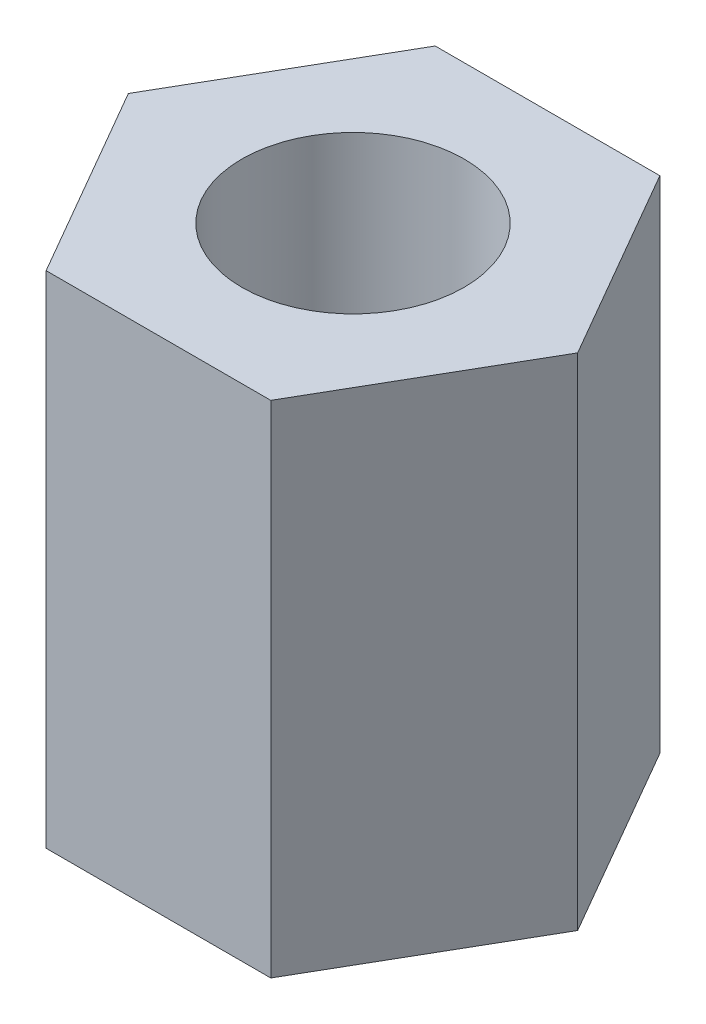
ISO-10303-21;
HEADER;
FILE_DESCRIPTION(('STEP AP214'),'2;1');
FILE_NAME('part.step','',(''),(''),'','','');
FILE_SCHEMA(('AUTOMOTIVE_DESIGN { 1 0 10303 214 1 1 1 1 }'));
ENDSEC;
DATA;
#1=APPLICATION_CONTEXT('core data for automotive mechanical design processes');
#2=APPLICATION_PROTOCOL_DEFINITION('international standard','automotive_design',2000,#1);
#3=PRODUCT_CONTEXT('',#1,'mechanical');
#4=PRODUCT('Part','Part','',(#3));
#5=PRODUCT_RELATED_PRODUCT_CATEGORY('part','',(#4));
#6=PRODUCT_DEFINITION_FORMATION('','',#4);
#7=PRODUCT_DEFINITION_CONTEXT('part definition',#1,'design');
#8=PRODUCT_DEFINITION('design','',#6,#7);
#9=PRODUCT_DEFINITION_SHAPE('','',#8);
#10=(LENGTH_UNIT() NAMED_UNIT(*) SI_UNIT(.MILLI.,.METRE.));
#11=(NAMED_UNIT(*) PLANE_ANGLE_UNIT() SI_UNIT($,.RADIAN.));
#12=(NAMED_UNIT(*) SI_UNIT($,.STERADIAN.) SOLID_ANGLE_UNIT());
#13=UNCERTAINTY_MEASURE_WITH_UNIT(LENGTH_MEASURE(1.E-05),#10,'distance_accuracy_value','');
#14=(GEOMETRIC_REPRESENTATION_CONTEXT(3) GLOBAL_UNCERTAINTY_ASSIGNED_CONTEXT((#13)) GLOBAL_UNIT_ASSIGNED_CONTEXT((#10,
#11,#12)) REPRESENTATION_CONTEXT('',''));
#15=CARTESIAN_POINT('',(0.,0.,0.));
#16=DIRECTION('',(0.,0.,1.));
#17=DIRECTION('',(1.,0.,0.));
#18=AXIS2_PLACEMENT_3D('',#15,#16,#17);
#19=CARTESIAN_POINT('',(0.,9.,0.));
#20=DIRECTION('',(0.,1.,0.));
#21=DIRECTION('',(0.,0.,1.));
#22=AXIS2_PLACEMENT_3D('',#19,#20,#21);
#23=PLANE('',#22);
#24=DIRECTION('',(0.499999999999995,0.,-0.866025403784442));
#25=VECTOR('',#24,1.);
#26=CARTESIAN_POINT('',(2.02072594216372,9.,3.49999999999996));
#27=LINE('',#26,#25);
#28=CARTESIAN_POINT('',(2.02072594216372,9.,3.49999999999996));
#29=VERTEX_POINT('',#28);
#30=CARTESIAN_POINT('',(4.04145188432737,9.,0.));
#31=VERTEX_POINT('',#30);
#32=EDGE_CURVE('E146',#29,#31,#27,.T.);
#33=ORIENTED_EDGE('',*,*,#32,.T.);
#34=DIRECTION('',(-0.500000000000001,0.,-0.866025403784438));
#35=VECTOR('',#34,1.);
#36=CARTESIAN_POINT('',(4.04145188432737,9.,0.));
#37=LINE('',#36,#35);
#38=CARTESIAN_POINT('',(2.02072594216367,9.,-3.49999999999999));
#39=VERTEX_POINT('',#38);
#40=EDGE_CURVE('E94',#31,#39,#37,.T.);
#41=ORIENTED_EDGE('',*,*,#40,.T.);
#42=DIRECTION('',(-1.,0.,0.));
#43=VECTOR('',#42,1.);
#44=CARTESIAN_POINT('',(2.02072594216367,9.,-3.49999999999999));
#45=LINE('',#44,#43);
#46=CARTESIAN_POINT('',(-2.0207259421637,9.,-3.49999999999998));
#47=VERTEX_POINT('',#46);
#48=EDGE_CURVE('E107',#39,#47,#45,.T.);
#49=ORIENTED_EDGE('',*,*,#48,.T.);
#50=DIRECTION('',(-0.499999999999995,0.,0.866025403784442));
#51=VECTOR('',#50,1.);
#52=CARTESIAN_POINT('',(-2.0207259421637,9.,-3.49999999999998));
#53=LINE('',#52,#51);
#54=CARTESIAN_POINT('',(-4.04145188432737,9.,0.));
#55=VERTEX_POINT('',#54);
#56=EDGE_CURVE('E101',#47,#55,#53,.T.);
#57=ORIENTED_EDGE('',*,*,#56,.T.);
#58=DIRECTION('',(0.500000000000007,0.,0.866025403784435));
#59=VECTOR('',#58,1.);
#60=CARTESIAN_POINT('',(-4.04145188432737,9.,0.));
#61=LINE('',#60,#59);
#62=CARTESIAN_POINT('',(-2.02072594216365,9.,3.50000000000001));
#63=VERTEX_POINT('',#62);
#64=EDGE_CURVE('E105',#55,#63,#61,.T.);
#65=ORIENTED_EDGE('',*,*,#64,.T.);
#66=DIRECTION('',(1.,0.,0.));
#67=VECTOR('',#66,1.);
#68=CARTESIAN_POINT('',(-2.02072594216365,9.,3.50000000000001));
#69=LINE('',#68,#67);
#70=EDGE_CURVE('E57',#63,#29,#69,.T.);
#71=ORIENTED_EDGE('',*,*,#70,.T.);
#72=EDGE_LOOP('',(#33,#41,#49,#57,#65,#71));
#73=FACE_BOUND('',#72,.T.);
#74=CARTESIAN_POINT('',(0.,9.,0.));
#75=DIRECTION('',(0.,1.,0.));
#76=DIRECTION('',(0.,0.,1.));
#77=AXIS2_PLACEMENT_3D('',#74,#75,#76);
#78=CIRCLE('',#77,2.);
#79=CARTESIAN_POINT('',(0.,9.,2.));
#80=VERTEX_POINT('',#79);
#81=EDGE_CURVE('E134',#80,#80,#78,.T.);
#82=ORIENTED_EDGE('',*,*,#81,.F.);
#83=EDGE_LOOP('',(#82));
#84=FACE_BOUND('',#83,.T.);
#85=ADVANCED_FACE('F39',(#73,#84),#23,.T.);
#86=CARTESIAN_POINT('',(0.,0.,0.));
#87=DIRECTION('',(0.,1.,0.));
#88=DIRECTION('',(0.,0.,1.));
#89=AXIS2_PLACEMENT_3D('',#86,#87,#88);
#90=PLANE('',#89);
#91=DIRECTION('',(0.499999999999995,0.,-0.866025403784442));
#92=VECTOR('',#91,1.);
#93=CARTESIAN_POINT('',(2.02072594216372,0.,3.49999999999996));
#94=LINE('',#93,#92);
#95=CARTESIAN_POINT('',(2.02072594216372,0.,3.49999999999996));
#96=VERTEX_POINT('',#95);
#97=CARTESIAN_POINT('',(4.04145188432737,0.,0.));
#98=VERTEX_POINT('',#97);
#99=EDGE_CURVE('E129',#96,#98,#94,.T.);
#100=ORIENTED_EDGE('',*,*,#99,.F.);
#101=DIRECTION('',(1.,0.,0.));
#102=VECTOR('',#101,1.);
#103=CARTESIAN_POINT('',(-2.02072594216365,0.,3.50000000000001));
#104=LINE('',#103,#102);
#105=CARTESIAN_POINT('',(-2.02072594216365,0.,3.50000000000001));
#106=VERTEX_POINT('',#105);
#107=EDGE_CURVE('E86',#106,#96,#104,.T.);
#108=ORIENTED_EDGE('',*,*,#107,.F.);
#109=DIRECTION('',(0.500000000000007,0.,0.866025403784435));
#110=VECTOR('',#109,1.);
#111=CARTESIAN_POINT('',(-4.04145188432737,0.,0.));
#112=LINE('',#111,#110);
#113=CARTESIAN_POINT('',(-4.04145188432737,0.,0.));
#114=VERTEX_POINT('',#113);
#115=EDGE_CURVE('E80',#114,#106,#112,.T.);
#116=ORIENTED_EDGE('',*,*,#115,.F.);
#117=DIRECTION('',(-0.499999999999995,0.,0.866025403784442));
#118=VECTOR('',#117,1.);
#119=CARTESIAN_POINT('',(-2.0207259421637,0.,-3.49999999999998));
#120=LINE('',#119,#118);
#121=CARTESIAN_POINT('',(-2.0207259421637,0.,-3.49999999999998));
#122=VERTEX_POINT('',#121);
#123=EDGE_CURVE('E116',#122,#114,#120,.T.);
#124=ORIENTED_EDGE('',*,*,#123,.F.);
#125=DIRECTION('',(-1.,0.,0.));
#126=VECTOR('',#125,1.);
#127=CARTESIAN_POINT('',(2.02072594216367,0.,-3.49999999999999));
#128=LINE('',#127,#126);
#129=CARTESIAN_POINT('',(2.02072594216367,0.,-3.49999999999999));
#130=VERTEX_POINT('',#129);
#131=EDGE_CURVE('E137',#130,#122,#128,.T.);
#132=ORIENTED_EDGE('',*,*,#131,.F.);
#133=DIRECTION('',(-0.500000000000001,0.,-0.866025403784438));
#134=VECTOR('',#133,1.);
#135=CARTESIAN_POINT('',(4.04145188432737,0.,0.));
#136=LINE('',#135,#134);
#137=EDGE_CURVE('E133',#98,#130,#136,.T.);
#138=ORIENTED_EDGE('',*,*,#137,.F.);
#139=EDGE_LOOP('',(#100,#108,#116,#124,#132,#138));
#140=FACE_BOUND('',#139,.T.);
#141=CARTESIAN_POINT('',(0.,0.,0.));
#142=DIRECTION('',(0.,1.,0.));
#143=DIRECTION('',(0.,0.,1.));
#144=AXIS2_PLACEMENT_3D('',#141,#142,#143);
#145=CIRCLE('',#144,2.);
#146=CARTESIAN_POINT('',(0.,0.,2.));
#147=VERTEX_POINT('',#146);
#148=EDGE_CURVE('E243',#147,#147,#145,.T.);
#149=ORIENTED_EDGE('',*,*,#148,.T.);
#150=EDGE_LOOP('',(#149));
#151=FACE_BOUND('',#150,.T.);
#152=ADVANCED_FACE('F159',(#140,#151),#90,.F.);
#153=CARTESIAN_POINT('',(2.02072594216372,9.,3.49999999999996));
#154=DIRECTION('',(-0.866025403784442,0.,-0.499999999999995));
#155=DIRECTION('',(-0.499999999999995,0.,0.866025403784442));
#156=AXIS2_PLACEMENT_3D('',#153,#154,#155);
#157=PLANE('',#156);
#158=ORIENTED_EDGE('',*,*,#99,.T.);
#159=DIRECTION('',(0.,-1.,0.));
#160=VECTOR('',#159,1.);
#161=CARTESIAN_POINT('',(4.04145188432737,9.,0.));
#162=LINE('',#161,#160);
#163=EDGE_CURVE('E11',#31,#98,#162,.T.);
#164=ORIENTED_EDGE('',*,*,#163,.F.);
#165=ORIENTED_EDGE('',*,*,#32,.F.);
#166=DIRECTION('',(0.,-1.,0.));
#167=VECTOR('',#166,1.);
#168=CARTESIAN_POINT('',(2.02072594216372,9.,3.49999999999996));
#169=LINE('',#168,#167);
#170=EDGE_CURVE('E125',#29,#96,#169,.T.);
#171=ORIENTED_EDGE('',*,*,#170,.T.);
#172=EDGE_LOOP('',(#158,#164,#165,#171));
#173=FACE_BOUND('',#172,.T.);
#174=ADVANCED_FACE('F41',(#173),#157,.F.);
#175=CARTESIAN_POINT('',(4.04145188432737,9.,0.));
#176=DIRECTION('',(-0.866025403784438,0.,0.500000000000001));
#177=DIRECTION('',(0.500000000000001,0.,0.866025403784438));
#178=AXIS2_PLACEMENT_3D('',#175,#176,#177);
#179=PLANE('',#178);
#180=ORIENTED_EDGE('',*,*,#137,.T.);
#181=DIRECTION('',(0.,-1.,0.));
#182=VECTOR('',#181,1.);
#183=CARTESIAN_POINT('',(2.02072594216367,9.,-3.49999999999999));
#184=LINE('',#183,#182);
#185=EDGE_CURVE('E49',#39,#130,#184,.T.);
#186=ORIENTED_EDGE('',*,*,#185,.F.);
#187=ORIENTED_EDGE('',*,*,#40,.F.);
#188=ORIENTED_EDGE('',*,*,#163,.T.);
#189=EDGE_LOOP('',(#180,#186,#187,#188));
#190=FACE_BOUND('',#189,.T.);
#191=ADVANCED_FACE('F184',(#190),#179,.F.);
#192=CARTESIAN_POINT('',(2.02072594216367,9.,-3.49999999999999));
#193=DIRECTION('',(0.,0.,1.));
#194=DIRECTION('',(1.,0.,0.));
#195=AXIS2_PLACEMENT_3D('',#192,#193,#194);
#196=PLANE('',#195);
#197=ORIENTED_EDGE('',*,*,#131,.T.);
#198=DIRECTION('',(0.,-1.,0.));
#199=VECTOR('',#198,1.);
#200=CARTESIAN_POINT('',(-2.0207259421637,9.,-3.49999999999998));
#201=LINE('',#200,#199);
#202=EDGE_CURVE('E118',#47,#122,#201,.T.);
#203=ORIENTED_EDGE('',*,*,#202,.F.);
#204=ORIENTED_EDGE('',*,*,#48,.F.);
#205=ORIENTED_EDGE('',*,*,#185,.T.);
#206=EDGE_LOOP('',(#197,#203,#204,#205));
#207=FACE_BOUND('',#206,.T.);
#208=ADVANCED_FACE('F156',(#207),#196,.F.);
#209=CARTESIAN_POINT('',(-2.0207259421637,9.,-3.49999999999998));
#210=DIRECTION('',(0.866025403784442,0.,0.499999999999995));
#211=DIRECTION('',(0.499999999999995,0.,-0.866025403784442));
#212=AXIS2_PLACEMENT_3D('',#209,#210,#211);
#213=PLANE('',#212);
#214=ORIENTED_EDGE('',*,*,#123,.T.);
#215=DIRECTION('',(0.,-1.,0.));
#216=VECTOR('',#215,1.);
#217=CARTESIAN_POINT('',(-4.04145188432737,9.,0.));
#218=LINE('',#217,#216);
#219=EDGE_CURVE('E113',#55,#114,#218,.T.);
#220=ORIENTED_EDGE('',*,*,#219,.F.);
#221=ORIENTED_EDGE('',*,*,#56,.F.);
#222=ORIENTED_EDGE('',*,*,#202,.T.);
#223=EDGE_LOOP('',(#214,#220,#221,#222));
#224=FACE_BOUND('',#223,.T.);
#225=ADVANCED_FACE('F114',(#224),#213,.F.);
#226=CARTESIAN_POINT('',(-4.04145188432737,9.,0.));
#227=DIRECTION('',(0.866025403784435,0.,-0.500000000000007));
#228=DIRECTION('',(-0.500000000000007,0.,-0.866025403784435));
#229=AXIS2_PLACEMENT_3D('',#226,#227,#228);
#230=PLANE('',#229);
#231=ORIENTED_EDGE('',*,*,#115,.T.);
#232=DIRECTION('',(0.,-1.,0.));
#233=VECTOR('',#232,1.);
#234=CARTESIAN_POINT('',(-2.02072594216365,9.,3.50000000000001));
#235=LINE('',#234,#233);
#236=EDGE_CURVE('E119',#63,#106,#235,.T.);
#237=ORIENTED_EDGE('',*,*,#236,.F.);
#238=ORIENTED_EDGE('',*,*,#64,.F.);
#239=ORIENTED_EDGE('',*,*,#219,.T.);
#240=EDGE_LOOP('',(#231,#237,#238,#239));
#241=FACE_BOUND('',#240,.T.);
#242=ADVANCED_FACE('F121',(#241),#230,.F.);
#243=CARTESIAN_POINT('',(-2.02072594216365,9.,3.50000000000001));
#244=DIRECTION('',(0.,0.,-1.));
#245=DIRECTION('',(-1.,0.,0.));
#246=AXIS2_PLACEMENT_3D('',#243,#244,#245);
#247=PLANE('',#246);
#248=ORIENTED_EDGE('',*,*,#107,.T.);
#249=ORIENTED_EDGE('',*,*,#170,.F.);
#250=ORIENTED_EDGE('',*,*,#70,.F.);
#251=ORIENTED_EDGE('',*,*,#236,.T.);
#252=EDGE_LOOP('',(#248,#249,#250,#251));
#253=FACE_BOUND('',#252,.T.);
#254=ADVANCED_FACE('F164',(#253),#247,.F.);
#255=CARTESIAN_POINT('',(0.,9.,0.));
#256=DIRECTION('',(0.,-1.,0.));
#257=DIRECTION('',(0.,0.,-1.));
#258=AXIS2_PLACEMENT_3D('',#255,#256,#257);
#259=CYLINDRICAL_SURFACE('',#258,2.);
#260=ORIENTED_EDGE('',*,*,#81,.T.);
#261=EDGE_LOOP('',(#260));
#262=FACE_BOUND('',#261,.T.);
#263=ORIENTED_EDGE('',*,*,#148,.F.);
#264=EDGE_LOOP('',(#263));
#265=FACE_BOUND('',#264,.T.);
#266=ADVANCED_FACE('F166',(#262,#265),#259,.F.);
#267=CLOSED_SHELL('',(#85,#152,#174,#191,#208,#225,#242,#254,#266));
#268=MANIFOLD_SOLID_BREP('B2',#267);
#269=ADVANCED_BREP_SHAPE_REPRESENTATION('',(#18,#268),#14);
#270=SHAPE_DEFINITION_REPRESENTATION(#9,#269);
ENDSEC;
END-ISO-10303-21;
